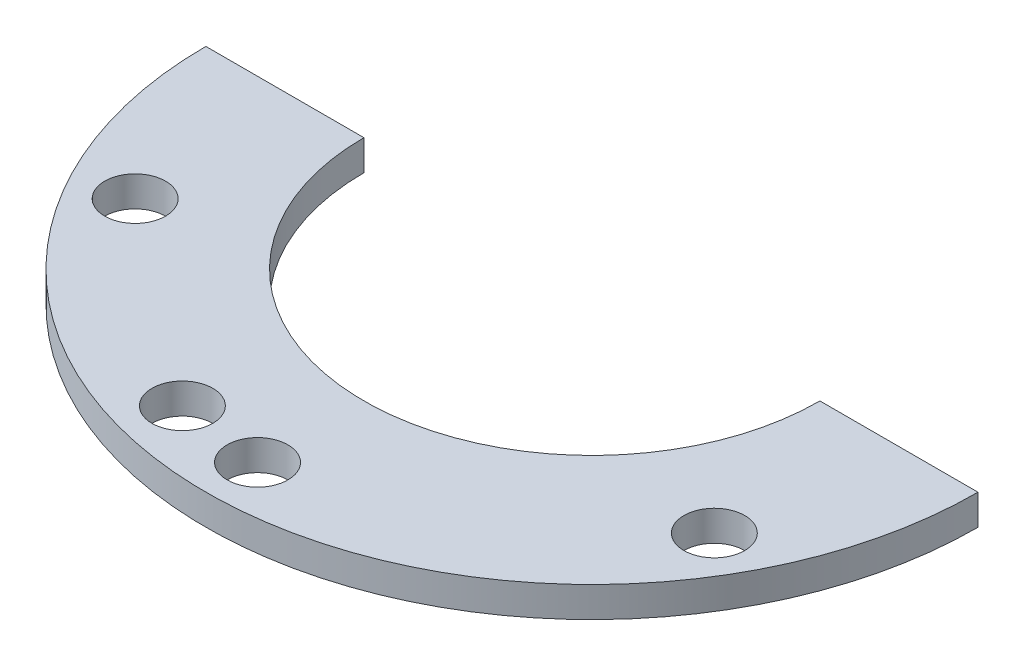
ISO-10303-21;
HEADER;
FILE_DESCRIPTION(('STEP AP214'),'2;1');
FILE_NAME('part.step','',(''),(''),'','','');
FILE_SCHEMA(('AUTOMOTIVE_DESIGN { 1 0 10303 214 1 1 1 1 }'));
ENDSEC;
DATA;
#1=APPLICATION_CONTEXT('core data for automotive mechanical design processes');
#2=APPLICATION_PROTOCOL_DEFINITION('international standard','automotive_design',2000,#1);
#3=PRODUCT_CONTEXT('',#1,'mechanical');
#4=PRODUCT('Part','Part','',(#3));
#5=PRODUCT_RELATED_PRODUCT_CATEGORY('part','',(#4));
#6=PRODUCT_DEFINITION_FORMATION('','',#4);
#7=PRODUCT_DEFINITION_CONTEXT('part definition',#1,'design');
#8=PRODUCT_DEFINITION('design','',#6,#7);
#9=PRODUCT_DEFINITION_SHAPE('','',#8);
#10=(LENGTH_UNIT() NAMED_UNIT(*) SI_UNIT(.MILLI.,.METRE.));
#11=(NAMED_UNIT(*) PLANE_ANGLE_UNIT() SI_UNIT($,.RADIAN.));
#12=(NAMED_UNIT(*) SI_UNIT($,.STERADIAN.) SOLID_ANGLE_UNIT());
#13=UNCERTAINTY_MEASURE_WITH_UNIT(LENGTH_MEASURE(1.E-05),#10,'distance_accuracy_value','');
#14=(GEOMETRIC_REPRESENTATION_CONTEXT(3) GLOBAL_UNCERTAINTY_ASSIGNED_CONTEXT((#13)) GLOBAL_UNIT_ASSIGNED_CONTEXT((#10,
#11,#12)) REPRESENTATION_CONTEXT('',''));
#15=CARTESIAN_POINT('',(0.,0.,0.));
#16=DIRECTION('',(0.,0.,1.));
#17=DIRECTION('',(1.,0.,0.));
#18=AXIS2_PLACEMENT_3D('',#15,#16,#17);
#19=CARTESIAN_POINT('',(0.,1.,0.));
#20=DIRECTION('',(0.,-1.,0.));
#21=DIRECTION('',(0.,0.,-1.));
#22=AXIS2_PLACEMENT_3D('',#19,#20,#21);
#23=CYLINDRICAL_SURFACE('',#22,12.7);
#24=CARTESIAN_POINT('',(0.,1.,0.));
#25=DIRECTION('',(0.,1.,0.));
#26=DIRECTION('',(0.,0.,1.));
#27=AXIS2_PLACEMENT_3D('',#24,#25,#26);
#28=CIRCLE('',#27,12.7);
#29=CARTESIAN_POINT('',(-12.7,1.,0.));
#30=VERTEX_POINT('',#29);
#31=CARTESIAN_POINT('',(12.7,1.,0.));
#32=VERTEX_POINT('',#31);
#33=EDGE_CURVE('E76',#30,#32,#28,.T.);
#34=ORIENTED_EDGE('',*,*,#33,.F.);
#35=DIRECTION('',(0.,-1.,0.));
#36=VECTOR('',#35,1.);
#37=CARTESIAN_POINT('',(-12.7,1.,0.));
#38=LINE('',#37,#36);
#39=CARTESIAN_POINT('',(-12.7,0.,0.));
#40=VERTEX_POINT('',#39);
#41=EDGE_CURVE('E124',#30,#40,#38,.T.);
#42=ORIENTED_EDGE('',*,*,#41,.T.);
#43=CARTESIAN_POINT('',(0.,0.,0.));
#44=DIRECTION('',(0.,1.,0.));
#45=DIRECTION('',(0.,0.,1.));
#46=AXIS2_PLACEMENT_3D('',#43,#44,#45);
#47=CIRCLE('',#46,12.7);
#48=CARTESIAN_POINT('',(12.7,0.,0.));
#49=VERTEX_POINT('',#48);
#50=EDGE_CURVE('E84',#40,#49,#47,.T.);
#51=ORIENTED_EDGE('',*,*,#50,.T.);
#52=DIRECTION('',(0.,-1.,0.));
#53=VECTOR('',#52,1.);
#54=CARTESIAN_POINT('',(12.7,1.,0.));
#55=LINE('',#54,#53);
#56=EDGE_CURVE('E88',#49,#32,#55,.F.);
#57=ORIENTED_EDGE('',*,*,#56,.T.);
#58=EDGE_LOOP('',(#34,#42,#51,#57));
#59=FACE_BOUND('',#58,.T.);
#60=ADVANCED_FACE('F32',(#59),#23,.T.);
#61=CARTESIAN_POINT('',(0.,1.,0.));
#62=DIRECTION('',(0.,1.,0.));
#63=DIRECTION('',(0.,0.,1.));
#64=AXIS2_PLACEMENT_3D('',#61,#62,#63);
#65=PLANE('',#64);
#66=DIRECTION('',(1.,0.,0.));
#67=VECTOR('',#66,1.);
#68=CARTESIAN_POINT('',(0.,1.,0.));
#69=LINE('',#68,#67);
#70=CARTESIAN_POINT('',(-7.5,1.,0.));
#71=VERTEX_POINT('',#70);
#72=EDGE_CURVE('E53',#30,#71,#69,.T.);
#73=ORIENTED_EDGE('',*,*,#72,.F.);
#74=ORIENTED_EDGE('',*,*,#33,.T.);
#75=CARTESIAN_POINT('',(7.5,1.,0.));
#76=VERTEX_POINT('',#75);
#77=EDGE_CURVE('E93',#76,#32,#69,.T.);
#78=ORIENTED_EDGE('',*,*,#77,.F.);
#79=CARTESIAN_POINT('',(0.,1.,0.));
#80=DIRECTION('',(0.,1.,0.));
#81=DIRECTION('',(0.,0.,1.));
#82=AXIS2_PLACEMENT_3D('',#79,#80,#81);
#83=CIRCLE('',#82,7.5);
#84=EDGE_CURVE('E87',#71,#76,#83,.T.);
#85=ORIENTED_EDGE('',*,*,#84,.F.);
#86=EDGE_LOOP('',(#73,#74,#78,#85));
#87=FACE_BOUND('',#86,.T.);
#88=CARTESIAN_POINT('',(-2.84700949612757,1.,10.6251840891796));
#89=DIRECTION('',(0.,1.,0.));
#90=DIRECTION('',(0.,0.,1.));
#91=AXIS2_PLACEMENT_3D('',#88,#89,#90);
#92=CIRCLE('',#91,1.);
#93=CARTESIAN_POINT('',(-2.84700949612757,1.,11.6251840891796));
#94=VERTEX_POINT('',#93);
#95=EDGE_CURVE('E117',#94,#94,#92,.T.);
#96=ORIENTED_EDGE('',*,*,#95,.F.);
#97=EDGE_LOOP('',(#96));
#98=FACE_BOUND('',#97,.T.);
#99=CARTESIAN_POINT('',(-9.52627944162847,1.,5.4999999999998));
#100=DIRECTION('',(0.,1.,0.));
#101=DIRECTION('',(0.,0.,1.));
#102=AXIS2_PLACEMENT_3D('',#99,#100,#101);
#103=CIRCLE('',#102,1.00000000000035);
#104=CARTESIAN_POINT('',(-9.52627944162847,1.,6.50000000000014));
#105=VERTEX_POINT('',#104);
#106=EDGE_CURVE('E114',#105,#105,#103,.T.);
#107=ORIENTED_EDGE('',*,*,#106,.F.);
#108=EDGE_LOOP('',(#107));
#109=FACE_BOUND('',#108,.T.);
#110=CARTESIAN_POINT('',(2.35922392732846E-13,1.,10.9999999999996));
#111=DIRECTION('',(0.,1.,0.));
#112=DIRECTION('',(0.,0.,1.));
#113=AXIS2_PLACEMENT_3D('',#110,#111,#112);
#114=CIRCLE('',#113,1.00000000000022);
#115=CARTESIAN_POINT('',(2.35922392732846E-13,1.,11.9999999999998));
#116=VERTEX_POINT('',#115);
#117=EDGE_CURVE('E111',#116,#116,#114,.T.);
#118=ORIENTED_EDGE('',*,*,#117,.F.);
#119=EDGE_LOOP('',(#118));
#120=FACE_BOUND('',#119,.T.);
#121=CARTESIAN_POINT('',(9.52627944162884,1.,5.4999999999996));
#122=DIRECTION('',(0.,1.,0.));
#123=DIRECTION('',(0.,0.,1.));
#124=AXIS2_PLACEMENT_3D('',#121,#122,#123);
#125=CIRCLE('',#124,1.00000000000043);
#126=CARTESIAN_POINT('',(9.52627944162884,1.,6.50000000000002));
#127=VERTEX_POINT('',#126);
#128=EDGE_CURVE('E106',#127,#127,#125,.T.);
#129=ORIENTED_EDGE('',*,*,#128,.F.);
#130=EDGE_LOOP('',(#129));
#131=FACE_BOUND('',#130,.T.);
#132=ADVANCED_FACE('F129',(#87,#98,#109,#120,#131),#65,.T.);
#133=CARTESIAN_POINT('',(0.,0.,0.));
#134=DIRECTION('',(0.,1.,0.));
#135=DIRECTION('',(0.,0.,1.));
#136=AXIS2_PLACEMENT_3D('',#133,#134,#135);
#137=PLANE('',#136);
#138=ORIENTED_EDGE('',*,*,#50,.F.);
#139=DIRECTION('',(1.,0.,0.));
#140=VECTOR('',#139,1.);
#141=CARTESIAN_POINT('',(0.,0.,0.));
#142=LINE('',#141,#140);
#143=CARTESIAN_POINT('',(-7.5,0.,0.));
#144=VERTEX_POINT('',#143);
#145=EDGE_CURVE('E70',#40,#144,#142,.T.);
#146=ORIENTED_EDGE('',*,*,#145,.T.);
#147=CARTESIAN_POINT('',(0.,0.,0.));
#148=DIRECTION('',(0.,1.,0.));
#149=DIRECTION('',(0.,0.,1.));
#150=AXIS2_PLACEMENT_3D('',#147,#148,#149);
#151=CIRCLE('',#150,7.5);
#152=CARTESIAN_POINT('',(7.5,0.,0.));
#153=VERTEX_POINT('',#152);
#154=EDGE_CURVE('E82',#144,#153,#151,.T.);
#155=ORIENTED_EDGE('',*,*,#154,.T.);
#156=EDGE_CURVE('E46',#153,#49,#142,.T.);
#157=ORIENTED_EDGE('',*,*,#156,.T.);
#158=EDGE_LOOP('',(#138,#146,#155,#157));
#159=FACE_BOUND('',#158,.T.);
#160=CARTESIAN_POINT('',(-2.84700949612757,0.,10.6251840891796));
#161=DIRECTION('',(0.,1.,0.));
#162=DIRECTION('',(0.,0.,1.));
#163=AXIS2_PLACEMENT_3D('',#160,#161,#162);
#164=CIRCLE('',#163,1.);
#165=CARTESIAN_POINT('',(-2.84700949612757,0.,11.6251840891796));
#166=VERTEX_POINT('',#165);
#167=EDGE_CURVE('E90',#166,#166,#164,.T.);
#168=ORIENTED_EDGE('',*,*,#167,.T.);
#169=EDGE_LOOP('',(#168));
#170=FACE_BOUND('',#169,.T.);
#171=CARTESIAN_POINT('',(-9.52627944162847,0.,5.4999999999998));
#172=DIRECTION('',(0.,1.,0.));
#173=DIRECTION('',(0.,0.,1.));
#174=AXIS2_PLACEMENT_3D('',#171,#172,#173);
#175=CIRCLE('',#174,1.00000000000035);
#176=CARTESIAN_POINT('',(-9.52627944162847,0.,6.50000000000014));
#177=VERTEX_POINT('',#176);
#178=EDGE_CURVE('E97',#177,#177,#175,.T.);
#179=ORIENTED_EDGE('',*,*,#178,.T.);
#180=EDGE_LOOP('',(#179));
#181=FACE_BOUND('',#180,.T.);
#182=CARTESIAN_POINT('',(2.39391839684799E-13,0.,10.9999999999996));
#183=DIRECTION('',(0.,1.,0.));
#184=DIRECTION('',(0.,0.,1.));
#185=AXIS2_PLACEMENT_3D('',#182,#183,#184);
#186=CIRCLE('',#185,1.00000000000022);
#187=CARTESIAN_POINT('',(2.39391839684799E-13,0.,11.9999999999998));
#188=VERTEX_POINT('',#187);
#189=EDGE_CURVE('E100',#188,#188,#186,.T.);
#190=ORIENTED_EDGE('',*,*,#189,.T.);
#191=EDGE_LOOP('',(#190));
#192=FACE_BOUND('',#191,.T.);
#193=CARTESIAN_POINT('',(9.52627944162883,0.,5.4999999999996));
#194=DIRECTION('',(0.,1.,0.));
#195=DIRECTION('',(0.,0.,1.));
#196=AXIS2_PLACEMENT_3D('',#193,#194,#195);
#197=CIRCLE('',#196,1.00000000000043);
#198=CARTESIAN_POINT('',(9.52627944162883,0.,6.50000000000003));
#199=VERTEX_POINT('',#198);
#200=EDGE_CURVE('E103',#199,#199,#197,.T.);
#201=ORIENTED_EDGE('',*,*,#200,.T.);
#202=EDGE_LOOP('',(#201));
#203=FACE_BOUND('',#202,.T.);
#204=ADVANCED_FACE('F80',(#159,#170,#181,#192,#203),#137,.F.);
#205=CARTESIAN_POINT('',(9.52627944162883,0.,5.4999999999996));
#206=DIRECTION('',(0.,1.,0.));
#207=DIRECTION('',(0.,0.,1.));
#208=AXIS2_PLACEMENT_3D('',#205,#206,#207);
#209=CYLINDRICAL_SURFACE('',#208,1.00000000000043);
#210=ORIENTED_EDGE('',*,*,#128,.T.);
#211=EDGE_LOOP('',(#210));
#212=FACE_BOUND('',#211,.T.);
#213=ORIENTED_EDGE('',*,*,#200,.F.);
#214=EDGE_LOOP('',(#213));
#215=FACE_BOUND('',#214,.T.);
#216=ADVANCED_FACE('F141',(#212,#215),#209,.F.);
#217=CARTESIAN_POINT('',(2.39391839684799E-13,0.,10.9999999999996));
#218=DIRECTION('',(0.,1.,0.));
#219=DIRECTION('',(0.,0.,1.));
#220=AXIS2_PLACEMENT_3D('',#217,#218,#219);
#221=CYLINDRICAL_SURFACE('',#220,1.00000000000022);
#222=ORIENTED_EDGE('',*,*,#117,.T.);
#223=EDGE_LOOP('',(#222));
#224=FACE_BOUND('',#223,.T.);
#225=ORIENTED_EDGE('',*,*,#189,.F.);
#226=EDGE_LOOP('',(#225));
#227=FACE_BOUND('',#226,.T.);
#228=ADVANCED_FACE('F144',(#224,#227),#221,.F.);
#229=CARTESIAN_POINT('',(-9.52627944162847,0.,5.4999999999998));
#230=DIRECTION('',(0.,1.,0.));
#231=DIRECTION('',(0.,0.,1.));
#232=AXIS2_PLACEMENT_3D('',#229,#230,#231);
#233=CYLINDRICAL_SURFACE('',#232,1.00000000000035);
#234=ORIENTED_EDGE('',*,*,#106,.T.);
#235=EDGE_LOOP('',(#234));
#236=FACE_BOUND('',#235,.T.);
#237=ORIENTED_EDGE('',*,*,#178,.F.);
#238=EDGE_LOOP('',(#237));
#239=FACE_BOUND('',#238,.T.);
#240=ADVANCED_FACE('F177',(#236,#239),#233,.F.);
#241=CARTESIAN_POINT('',(-2.84700949612757,0.,10.6251840891796));
#242=DIRECTION('',(0.,1.,0.));
#243=DIRECTION('',(0.,0.,1.));
#244=AXIS2_PLACEMENT_3D('',#241,#242,#243);
#245=CYLINDRICAL_SURFACE('',#244,1.);
#246=ORIENTED_EDGE('',*,*,#95,.T.);
#247=EDGE_LOOP('',(#246));
#248=FACE_BOUND('',#247,.T.);
#249=ORIENTED_EDGE('',*,*,#167,.F.);
#250=EDGE_LOOP('',(#249));
#251=FACE_BOUND('',#250,.T.);
#252=ADVANCED_FACE('F187',(#248,#251),#245,.F.);
#253=CARTESIAN_POINT('',(0.,0.,0.));
#254=DIRECTION('',(0.,1.,0.));
#255=DIRECTION('',(0.,0.,1.));
#256=AXIS2_PLACEMENT_3D('',#253,#254,#255);
#257=CYLINDRICAL_SURFACE('',#256,7.5);
#258=ORIENTED_EDGE('',*,*,#84,.T.);
#259=DIRECTION('',(0.,1.,0.));
#260=VECTOR('',#259,1.);
#261=CARTESIAN_POINT('',(7.5,0.,0.));
#262=LINE('',#261,#260);
#263=EDGE_CURVE('E11',#76,#153,#262,.F.);
#264=ORIENTED_EDGE('',*,*,#263,.T.);
#265=ORIENTED_EDGE('',*,*,#154,.F.);
#266=DIRECTION('',(0.,1.,0.));
#267=VECTOR('',#266,1.);
#268=CARTESIAN_POINT('',(-7.5,0.,0.));
#269=LINE('',#268,#267);
#270=EDGE_CURVE('E39',#144,#71,#269,.T.);
#271=ORIENTED_EDGE('',*,*,#270,.T.);
#272=EDGE_LOOP('',(#258,#264,#265,#271));
#273=FACE_BOUND('',#272,.T.);
#274=ADVANCED_FACE('F86',(#273),#257,.F.);
#275=CARTESIAN_POINT('',(0.,0.,0.));
#276=DIRECTION('',(0.,0.,1.));
#277=DIRECTION('',(1.,0.,0.));
#278=AXIS2_PLACEMENT_3D('',#275,#276,#277);
#279=PLANE('',#278);
#280=ORIENTED_EDGE('',*,*,#72,.T.);
#281=ORIENTED_EDGE('',*,*,#270,.F.);
#282=ORIENTED_EDGE('',*,*,#145,.F.);
#283=ORIENTED_EDGE('',*,*,#41,.F.);
#284=EDGE_LOOP('',(#280,#281,#282,#283));
#285=FACE_BOUND('',#284,.T.);
#286=ADVANCED_FACE('F69',(#285),#279,.F.);
#287=ORIENTED_EDGE('',*,*,#156,.F.);
#288=ORIENTED_EDGE('',*,*,#263,.F.);
#289=ORIENTED_EDGE('',*,*,#77,.T.);
#290=ORIENTED_EDGE('',*,*,#56,.F.);
#291=EDGE_LOOP('',(#287,#288,#289,#290));
#292=FACE_BOUND('',#291,.T.);
#293=ADVANCED_FACE('F127',(#292),#279,.F.);
#294=CLOSED_SHELL('',(#60,#132,#204,#216,#228,#240,#252,#274,#286,#293));
#295=MANIFOLD_SOLID_BREP('B2',#294);
#296=ADVANCED_BREP_SHAPE_REPRESENTATION('',(#18,#295),#14);
#297=SHAPE_DEFINITION_REPRESENTATION(#9,#296);
ENDSEC;
END-ISO-10303-21;
